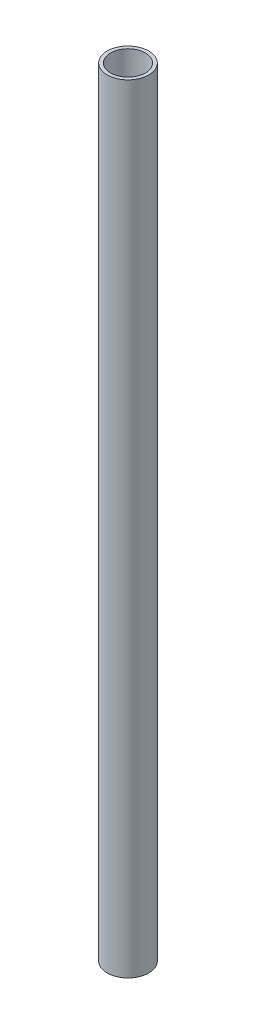
ISO-10303-21;
HEADER;
FILE_DESCRIPTION(('STEP AP214'),'2;1');
FILE_NAME('part.step','',(''),(''),'','','');
FILE_SCHEMA(('AUTOMOTIVE_DESIGN { 1 0 10303 214 1 1 1 1 }'));
ENDSEC;
DATA;
#1=APPLICATION_CONTEXT('core data for automotive mechanical design processes');
#2=APPLICATION_PROTOCOL_DEFINITION('international standard','automotive_design',2000,#1);
#3=PRODUCT_CONTEXT('',#1,'mechanical');
#4=PRODUCT('Part','Part','',(#3));
#5=PRODUCT_RELATED_PRODUCT_CATEGORY('part','',(#4));
#6=PRODUCT_DEFINITION_FORMATION('','',#4);
#7=PRODUCT_DEFINITION_CONTEXT('part definition',#1,'design');
#8=PRODUCT_DEFINITION('design','',#6,#7);
#9=PRODUCT_DEFINITION_SHAPE('','',#8);
#10=(LENGTH_UNIT() NAMED_UNIT(*) SI_UNIT(.MILLI.,.METRE.));
#11=(NAMED_UNIT(*) PLANE_ANGLE_UNIT() SI_UNIT($,.RADIAN.));
#12=(NAMED_UNIT(*) SI_UNIT($,.STERADIAN.) SOLID_ANGLE_UNIT());
#13=UNCERTAINTY_MEASURE_WITH_UNIT(LENGTH_MEASURE(1.E-05),#10,'distance_accuracy_value','');
#14=(GEOMETRIC_REPRESENTATION_CONTEXT(3) GLOBAL_UNCERTAINTY_ASSIGNED_CONTEXT((#13)) GLOBAL_UNIT_ASSIGNED_CONTEXT((#10,
#11,#12)) REPRESENTATION_CONTEXT('',''));
#15=CARTESIAN_POINT('',(0.,0.,0.));
#16=DIRECTION('',(0.,0.,1.));
#17=DIRECTION('',(1.,0.,0.));
#18=AXIS2_PLACEMENT_3D('',#15,#16,#17);
#19=CARTESIAN_POINT('',(0.,270.,0.));
#20=DIRECTION('',(0.,1.,0.));
#21=DIRECTION('',(0.,0.,1.));
#22=AXIS2_PLACEMENT_3D('',#19,#20,#21);
#23=PLANE('',#22);
#24=CARTESIAN_POINT('',(0.,270.,0.));
#25=DIRECTION('',(0.,1.,0.));
#26=DIRECTION('',(0.,0.,1.));
#27=AXIS2_PLACEMENT_3D('',#24,#25,#26);
#28=CIRCLE('',#27,7.75);
#29=CARTESIAN_POINT('',(0.,270.,7.75));
#30=VERTEX_POINT('',#29);
#31=EDGE_CURVE('E10',#30,#30,#28,.T.);
#32=ORIENTED_EDGE('',*,*,#31,.T.);
#33=EDGE_LOOP('',(#32));
#34=FACE_BOUND('',#33,.T.);
#35=CARTESIAN_POINT('',(0.,270.,0.));
#36=DIRECTION('',(0.,1.,0.));
#37=DIRECTION('',(0.,0.,1.));
#38=AXIS2_PLACEMENT_3D('',#35,#36,#37);
#39=CIRCLE('',#38,6.5);
#40=CARTESIAN_POINT('',(0.,270.,6.5));
#41=VERTEX_POINT('',#40);
#42=EDGE_CURVE('E38',#41,#41,#39,.T.);
#43=ORIENTED_EDGE('',*,*,#42,.F.);
#44=EDGE_LOOP('',(#43));
#45=FACE_BOUND('',#44,.T.);
#46=ADVANCED_FACE('F31',(#34,#45),#23,.T.);
#47=CARTESIAN_POINT('',(0.,270.,0.));
#48=DIRECTION('',(0.,-1.,0.));
#49=DIRECTION('',(0.,0.,-1.));
#50=AXIS2_PLACEMENT_3D('',#47,#48,#49);
#51=CYLINDRICAL_SURFACE('',#50,7.75);
#52=ORIENTED_EDGE('',*,*,#31,.F.);
#53=EDGE_LOOP('',(#52));
#54=FACE_BOUND('',#53,.T.);
#55=CARTESIAN_POINT('',(0.,-20.4764296628904,0.));
#56=DIRECTION('',(0.,1.,0.));
#57=DIRECTION('',(0.,0.,1.));
#58=AXIS2_PLACEMENT_3D('',#55,#56,#57);
#59=CIRCLE('',#58,7.75);
#60=CARTESIAN_POINT('',(0.,-20.4764296628904,7.75));
#61=VERTEX_POINT('',#60);
#62=EDGE_CURVE('E42',#61,#61,#59,.T.);
#63=ORIENTED_EDGE('',*,*,#62,.T.);
#64=EDGE_LOOP('',(#63));
#65=FACE_BOUND('',#64,.T.);
#66=ADVANCED_FACE('F33',(#54,#65),#51,.T.);
#67=CARTESIAN_POINT('',(0.,270.,0.));
#68=DIRECTION('',(0.,-1.,0.));
#69=DIRECTION('',(0.,0.,-1.));
#70=AXIS2_PLACEMENT_3D('',#67,#68,#69);
#71=CYLINDRICAL_SURFACE('',#70,6.5);
#72=ORIENTED_EDGE('',*,*,#42,.T.);
#73=EDGE_LOOP('',(#72));
#74=FACE_BOUND('',#73,.T.);
#75=CARTESIAN_POINT('',(0.,-20.4764296628904,0.));
#76=DIRECTION('',(0.,1.,0.));
#77=DIRECTION('',(0.,0.,1.));
#78=AXIS2_PLACEMENT_3D('',#75,#76,#77);
#79=CIRCLE('',#78,6.5);
#80=CARTESIAN_POINT('',(0.,-20.4764296628904,6.5));
#81=VERTEX_POINT('',#80);
#82=EDGE_CURVE('E46',#81,#81,#79,.T.);
#83=ORIENTED_EDGE('',*,*,#82,.F.);
#84=EDGE_LOOP('',(#83));
#85=FACE_BOUND('',#84,.T.);
#86=ADVANCED_FACE('F55',(#74,#85),#71,.F.);
#87=CARTESIAN_POINT('',(0.,-20.4764296628904,0.));
#88=DIRECTION('',(0.,1.,0.));
#89=DIRECTION('',(0.,0.,1.));
#90=AXIS2_PLACEMENT_3D('',#87,#88,#89);
#91=PLANE('',#90);
#92=ORIENTED_EDGE('',*,*,#82,.T.);
#93=EDGE_LOOP('',(#92));
#94=FACE_BOUND('',#93,.T.);
#95=ORIENTED_EDGE('',*,*,#62,.F.);
#96=EDGE_LOOP('',(#95));
#97=FACE_BOUND('',#96,.T.);
#98=ADVANCED_FACE('F52',(#94,#97),#91,.F.);
#99=CLOSED_SHELL('',(#46,#66,#86,#98));
#100=MANIFOLD_SOLID_BREP('B2',#99);
#101=ADVANCED_BREP_SHAPE_REPRESENTATION('',(#18,#100),#14);
#102=SHAPE_DEFINITION_REPRESENTATION(#9,#101);
ENDSEC;
END-ISO-10303-21;
